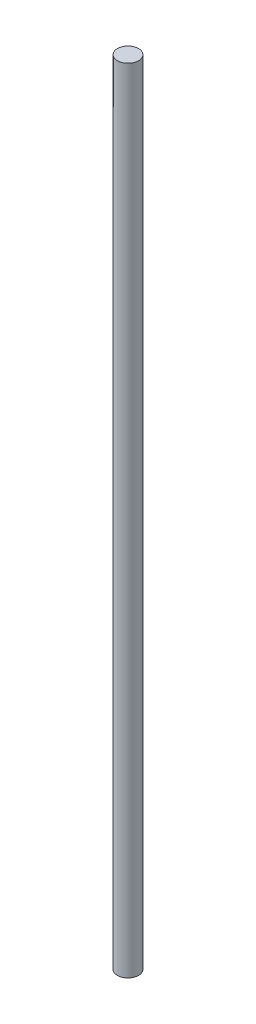
ISO-10303-21;
HEADER;
FILE_DESCRIPTION(('STEP AP214'),'2;1');
FILE_NAME('part.step','',(''),(''),'','','');
FILE_SCHEMA(('AUTOMOTIVE_DESIGN { 1 0 10303 214 1 1 1 1 }'));
ENDSEC;
DATA;
#1=APPLICATION_CONTEXT('core data for automotive mechanical design processes');
#2=APPLICATION_PROTOCOL_DEFINITION('international standard','automotive_design',2000,#1);
#3=PRODUCT_CONTEXT('',#1,'mechanical');
#4=PRODUCT('Part','Part','',(#3));
#5=PRODUCT_RELATED_PRODUCT_CATEGORY('part','',(#4));
#6=PRODUCT_DEFINITION_FORMATION('','',#4);
#7=PRODUCT_DEFINITION_CONTEXT('part definition',#1,'design');
#8=PRODUCT_DEFINITION('design','',#6,#7);
#9=PRODUCT_DEFINITION_SHAPE('','',#8);
#10=(LENGTH_UNIT() NAMED_UNIT(*) SI_UNIT(.MILLI.,.METRE.));
#11=(NAMED_UNIT(*) PLANE_ANGLE_UNIT() SI_UNIT($,.RADIAN.));
#12=(NAMED_UNIT(*) SI_UNIT($,.STERADIAN.) SOLID_ANGLE_UNIT());
#13=UNCERTAINTY_MEASURE_WITH_UNIT(LENGTH_MEASURE(1.E-05),#10,'distance_accuracy_value','');
#14=(GEOMETRIC_REPRESENTATION_CONTEXT(3) GLOBAL_UNCERTAINTY_ASSIGNED_CONTEXT((#13)) GLOBAL_UNIT_ASSIGNED_CONTEXT((#10,
#11,#12)) REPRESENTATION_CONTEXT('',''));
#15=CARTESIAN_POINT('',(0.,0.,0.));
#16=DIRECTION('',(0.,0.,1.));
#17=DIRECTION('',(1.,0.,0.));
#18=AXIS2_PLACEMENT_3D('',#15,#16,#17);
#19=CARTESIAN_POINT('',(0.,112.44,0.));
#20=DIRECTION('',(0.,-1.,0.));
#21=DIRECTION('',(0.,0.,-1.));
#22=AXIS2_PLACEMENT_3D('',#19,#20,#21);
#23=CYLINDRICAL_SURFACE('',#22,1.5);
#24=CARTESIAN_POINT('',(0.,112.44,0.));
#25=DIRECTION('',(0.,1.,0.));
#26=DIRECTION('',(0.,0.,1.));
#27=AXIS2_PLACEMENT_3D('',#24,#25,#26);
#28=CIRCLE('',#27,1.5);
#29=CARTESIAN_POINT('',(0.,112.44,1.5));
#30=VERTEX_POINT('',#29);
#31=EDGE_CURVE('E10',#30,#30,#28,.T.);
#32=ORIENTED_EDGE('',*,*,#31,.F.);
#33=EDGE_LOOP('',(#32));
#34=FACE_BOUND('',#33,.T.);
#35=CARTESIAN_POINT('',(0.,0.,0.));
#36=DIRECTION('',(0.,1.,0.));
#37=DIRECTION('',(0.,0.,1.));
#38=AXIS2_PLACEMENT_3D('',#35,#36,#37);
#39=CIRCLE('',#38,1.5);
#40=CARTESIAN_POINT('',(0.,0.,1.5));
#41=VERTEX_POINT('',#40);
#42=EDGE_CURVE('E34',#41,#41,#39,.T.);
#43=ORIENTED_EDGE('',*,*,#42,.T.);
#44=EDGE_LOOP('',(#43));
#45=FACE_BOUND('',#44,.T.);
#46=ADVANCED_FACE('F31',(#34,#45),#23,.T.);
#47=CARTESIAN_POINT('',(0.,112.44,0.));
#48=DIRECTION('',(0.,1.,0.));
#49=DIRECTION('',(0.,0.,1.));
#50=AXIS2_PLACEMENT_3D('',#47,#48,#49);
#51=PLANE('',#50);
#52=ORIENTED_EDGE('',*,*,#31,.T.);
#53=EDGE_LOOP('',(#52));
#54=FACE_BOUND('',#53,.T.);
#55=ADVANCED_FACE('F46',(#54),#51,.T.);
#56=CARTESIAN_POINT('',(0.,0.,0.));
#57=DIRECTION('',(0.,1.,0.));
#58=DIRECTION('',(0.,0.,1.));
#59=AXIS2_PLACEMENT_3D('',#56,#57,#58);
#60=PLANE('',#59);
#61=ORIENTED_EDGE('',*,*,#42,.F.);
#62=EDGE_LOOP('',(#61));
#63=FACE_BOUND('',#62,.T.);
#64=ADVANCED_FACE('F44',(#63),#60,.F.);
#65=CLOSED_SHELL('',(#46,#55,#64));
#66=MANIFOLD_SOLID_BREP('B2',#65);
#67=ADVANCED_BREP_SHAPE_REPRESENTATION('',(#18,#66),#14);
#68=SHAPE_DEFINITION_REPRESENTATION(#9,#67);
ENDSEC;
END-ISO-10303-21;
